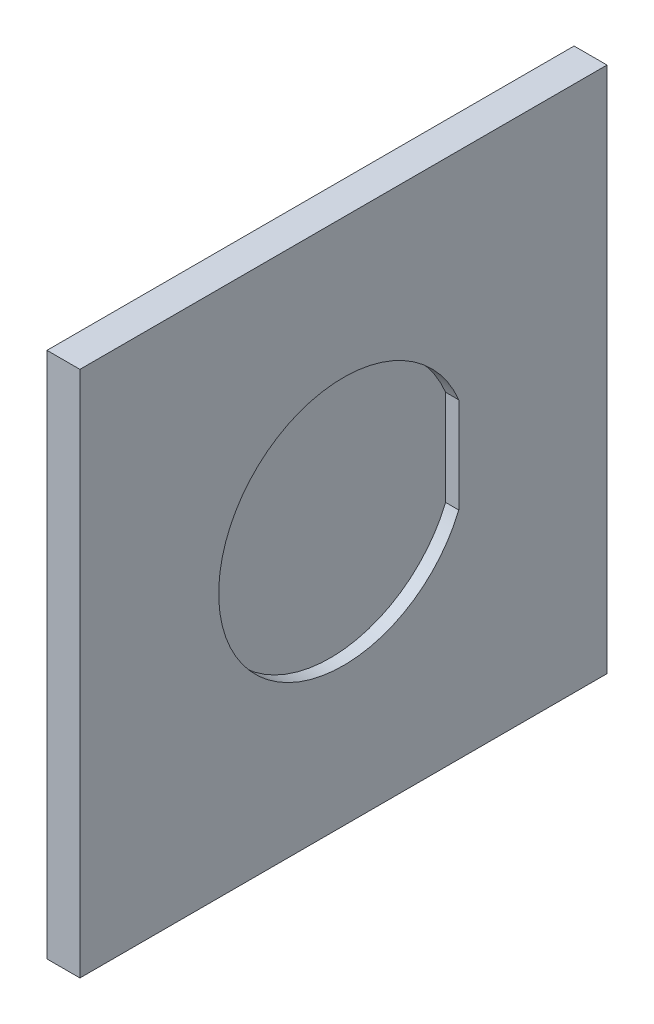
ISO-10303-21;
HEADER;
FILE_DESCRIPTION(('STEP AP214'),'2;1');
FILE_NAME('part.step','',(''),(''),'','','');
FILE_SCHEMA(('AUTOMOTIVE_DESIGN { 1 0 10303 214 1 1 1 1 }'));
ENDSEC;
DATA;
#1=APPLICATION_CONTEXT('core data for automotive mechanical design processes');
#2=APPLICATION_PROTOCOL_DEFINITION('international standard','automotive_design',2000,#1);
#3=PRODUCT_CONTEXT('',#1,'mechanical');
#4=PRODUCT('Part','Part','',(#3));
#5=PRODUCT_RELATED_PRODUCT_CATEGORY('part','',(#4));
#6=PRODUCT_DEFINITION_FORMATION('','',#4);
#7=PRODUCT_DEFINITION_CONTEXT('part definition',#1,'design');
#8=PRODUCT_DEFINITION('design','',#6,#7);
#9=PRODUCT_DEFINITION_SHAPE('','',#8);
#10=(LENGTH_UNIT() NAMED_UNIT(*) SI_UNIT(.MILLI.,.METRE.));
#11=(NAMED_UNIT(*) PLANE_ANGLE_UNIT() SI_UNIT($,.RADIAN.));
#12=(NAMED_UNIT(*) SI_UNIT($,.STERADIAN.) SOLID_ANGLE_UNIT());
#13=UNCERTAINTY_MEASURE_WITH_UNIT(LENGTH_MEASURE(1.E-05),#10,'distance_accuracy_value','');
#14=(GEOMETRIC_REPRESENTATION_CONTEXT(3) GLOBAL_UNCERTAINTY_ASSIGNED_CONTEXT((#13)) GLOBAL_UNIT_ASSIGNED_CONTEXT((#10,
#11,#12)) REPRESENTATION_CONTEXT('',''));
#15=CARTESIAN_POINT('',(0.,0.,0.));
#16=DIRECTION('',(0.,0.,1.));
#17=DIRECTION('',(1.,0.,0.));
#18=AXIS2_PLACEMENT_3D('',#15,#16,#17);
#19=CARTESIAN_POINT('',(5.,0.,0.));
#20=DIRECTION('',(-1.,0.,0.));
#21=DIRECTION('',(0.,0.,1.));
#22=AXIS2_PLACEMENT_3D('',#19,#20,#21);
#23=PLANE('',#22);
#24=DIRECTION('',(0.,-1.,0.));
#25=VECTOR('',#24,1.);
#26=CARTESIAN_POINT('',(5.,0.,-57.5));
#27=LINE('',#26,#25);
#28=CARTESIAN_POINT('',(5.,47.24105,-57.5));
#29=VERTEX_POINT('',#28);
#30=CARTESIAN_POINT('',(5.,32.75895,-57.5));
#31=VERTEX_POINT('',#30);
#32=EDGE_CURVE('E49',#29,#31,#27,.T.);
#33=ORIENTED_EDGE('',*,*,#32,.T.);
#34=CARTESIAN_POINT('',(5.,40.,-40.));
#35=DIRECTION('',(-1.,0.,0.));
#36=DIRECTION('',(0.,0.,1.));
#37=AXIS2_PLACEMENT_3D('',#34,#35,#36);
#38=CIRCLE('',#37,18.9389230185483);
#39=EDGE_CURVE('E11',#31,#29,#38,.T.);
#40=ORIENTED_EDGE('',*,*,#39,.T.);
#41=EDGE_LOOP('',(#33,#40));
#42=FACE_BOUND('',#41,.T.);
#43=DIRECTION('',(0.,-1.,0.));
#44=VECTOR('',#43,1.);
#45=CARTESIAN_POINT('',(5.,0.,0.));
#46=LINE('',#45,#44);
#47=CARTESIAN_POINT('',(5.,80.,0.));
#48=VERTEX_POINT('',#47);
#49=CARTESIAN_POINT('',(5.,0.,0.));
#50=VERTEX_POINT('',#49);
#51=EDGE_CURVE('E120',#48,#50,#46,.T.);
#52=ORIENTED_EDGE('',*,*,#51,.T.);
#53=DIRECTION('',(0.,0.,-1.));
#54=VECTOR('',#53,1.);
#55=CARTESIAN_POINT('',(5.,0.,0.));
#56=LINE('',#55,#54);
#57=CARTESIAN_POINT('',(5.,0.,-80.));
#58=VERTEX_POINT('',#57);
#59=EDGE_CURVE('E94',#50,#58,#56,.T.);
#60=ORIENTED_EDGE('',*,*,#59,.T.);
#61=DIRECTION('',(0.,1.,0.));
#62=VECTOR('',#61,1.);
#63=CARTESIAN_POINT('',(5.,0.,-80.));
#64=LINE('',#63,#62);
#65=CARTESIAN_POINT('',(5.,80.,-80.));
#66=VERTEX_POINT('',#65);
#67=EDGE_CURVE('E123',#58,#66,#64,.T.);
#68=ORIENTED_EDGE('',*,*,#67,.T.);
#69=DIRECTION('',(0.,0.,1.));
#70=VECTOR('',#69,1.);
#71=CARTESIAN_POINT('',(5.,80.,0.));
#72=LINE('',#71,#70);
#73=EDGE_CURVE('E65',#66,#48,#72,.T.);
#74=ORIENTED_EDGE('',*,*,#73,.T.);
#75=EDGE_LOOP('',(#52,#60,#68,#74));
#76=FACE_BOUND('',#75,.T.);
#77=ADVANCED_FACE('F41',(#42,#76),#23,.F.);
#78=CARTESIAN_POINT('',(5.,0.,0.));
#79=DIRECTION('',(0.,0.,-1.));
#80=DIRECTION('',(-1.,0.,0.));
#81=AXIS2_PLACEMENT_3D('',#78,#79,#80);
#82=PLANE('',#81);
#83=DIRECTION('',(0.,-1.,0.));
#84=VECTOR('',#83,1.);
#85=CARTESIAN_POINT('',(0.,0.,0.));
#86=LINE('',#85,#84);
#87=CARTESIAN_POINT('',(0.,80.,0.));
#88=VERTEX_POINT('',#87);
#89=CARTESIAN_POINT('',(0.,0.,0.));
#90=VERTEX_POINT('',#89);
#91=EDGE_CURVE('E118',#88,#90,#86,.T.);
#92=ORIENTED_EDGE('',*,*,#91,.T.);
#93=DIRECTION('',(-1.,0.,0.));
#94=VECTOR('',#93,1.);
#95=CARTESIAN_POINT('',(5.,0.,0.));
#96=LINE('',#95,#94);
#97=EDGE_CURVE('E140',#50,#90,#96,.T.);
#98=ORIENTED_EDGE('',*,*,#97,.F.);
#99=ORIENTED_EDGE('',*,*,#51,.F.);
#100=DIRECTION('',(-1.,0.,0.));
#101=VECTOR('',#100,1.);
#102=CARTESIAN_POINT('',(5.,80.,0.));
#103=LINE('',#102,#101);
#104=EDGE_CURVE('E126',#48,#88,#103,.T.);
#105=ORIENTED_EDGE('',*,*,#104,.T.);
#106=EDGE_LOOP('',(#92,#98,#99,#105));
#107=FACE_BOUND('',#106,.T.);
#108=ADVANCED_FACE('F43',(#107),#82,.F.);
#109=CARTESIAN_POINT('',(5.,0.,0.));
#110=DIRECTION('',(0.,1.,0.));
#111=DIRECTION('',(0.,0.,1.));
#112=AXIS2_PLACEMENT_3D('',#109,#110,#111);
#113=PLANE('',#112);
#114=DIRECTION('',(0.,0.,-1.));
#115=VECTOR('',#114,1.);
#116=CARTESIAN_POINT('',(0.,0.,0.));
#117=LINE('',#116,#115);
#118=CARTESIAN_POINT('',(0.,0.,-80.));
#119=VERTEX_POINT('',#118);
#120=EDGE_CURVE('E129',#90,#119,#117,.T.);
#121=ORIENTED_EDGE('',*,*,#120,.T.);
#122=DIRECTION('',(-1.,0.,0.));
#123=VECTOR('',#122,1.);
#124=CARTESIAN_POINT('',(5.,0.,-80.));
#125=LINE('',#124,#123);
#126=EDGE_CURVE('E137',#58,#119,#125,.T.);
#127=ORIENTED_EDGE('',*,*,#126,.F.);
#128=ORIENTED_EDGE('',*,*,#59,.F.);
#129=ORIENTED_EDGE('',*,*,#97,.T.);
#130=EDGE_LOOP('',(#121,#127,#128,#129));
#131=FACE_BOUND('',#130,.T.);
#132=ADVANCED_FACE('F148',(#131),#113,.F.);
#133=CARTESIAN_POINT('',(5.,0.,-80.));
#134=DIRECTION('',(0.,0.,1.));
#135=DIRECTION('',(1.,0.,0.));
#136=AXIS2_PLACEMENT_3D('',#133,#134,#135);
#137=PLANE('',#136);
#138=DIRECTION('',(0.,1.,0.));
#139=VECTOR('',#138,1.);
#140=CARTESIAN_POINT('',(0.,0.,-80.));
#141=LINE('',#140,#139);
#142=CARTESIAN_POINT('',(0.,80.,-80.));
#143=VERTEX_POINT('',#142);
#144=EDGE_CURVE('E131',#119,#143,#141,.T.);
#145=ORIENTED_EDGE('',*,*,#144,.T.);
#146=DIRECTION('',(-1.,0.,0.));
#147=VECTOR('',#146,1.);
#148=CARTESIAN_POINT('',(5.,80.,-80.));
#149=LINE('',#148,#147);
#150=EDGE_CURVE('E135',#66,#143,#149,.T.);
#151=ORIENTED_EDGE('',*,*,#150,.F.);
#152=ORIENTED_EDGE('',*,*,#67,.F.);
#153=ORIENTED_EDGE('',*,*,#126,.T.);
#154=EDGE_LOOP('',(#145,#151,#152,#153));
#155=FACE_BOUND('',#154,.T.);
#156=ADVANCED_FACE('F153',(#155),#137,.F.);
#157=CARTESIAN_POINT('',(5.,80.,0.));
#158=DIRECTION('',(0.,-1.,0.));
#159=DIRECTION('',(0.,0.,-1.));
#160=AXIS2_PLACEMENT_3D('',#157,#158,#159);
#161=PLANE('',#160);
#162=DIRECTION('',(0.,0.,1.));
#163=VECTOR('',#162,1.);
#164=CARTESIAN_POINT('',(0.,80.,0.));
#165=LINE('',#164,#163);
#166=EDGE_CURVE('E86',#143,#88,#165,.T.);
#167=ORIENTED_EDGE('',*,*,#166,.T.);
#168=ORIENTED_EDGE('',*,*,#104,.F.);
#169=ORIENTED_EDGE('',*,*,#73,.F.);
#170=ORIENTED_EDGE('',*,*,#150,.T.);
#171=EDGE_LOOP('',(#167,#168,#169,#170));
#172=FACE_BOUND('',#171,.T.);
#173=ADVANCED_FACE('F157',(#172),#161,.F.);
#174=CARTESIAN_POINT('',(0.,0.,0.));
#175=DIRECTION('',(-1.,0.,0.));
#176=DIRECTION('',(0.,0.,1.));
#177=AXIS2_PLACEMENT_3D('',#174,#175,#176);
#178=PLANE('',#177);
#179=ORIENTED_EDGE('',*,*,#91,.F.);
#180=ORIENTED_EDGE('',*,*,#166,.F.);
#181=ORIENTED_EDGE('',*,*,#144,.F.);
#182=ORIENTED_EDGE('',*,*,#120,.F.);
#183=EDGE_LOOP('',(#179,#180,#181,#182));
#184=FACE_BOUND('',#183,.T.);
#185=ADVANCED_FACE('F155',(#184),#178,.T.);
#186=CARTESIAN_POINT('',(3.,40.,-40.));
#187=DIRECTION('',(1.,0.,0.));
#188=DIRECTION('',(0.,0.,-1.));
#189=AXIS2_PLACEMENT_3D('',#186,#187,#188);
#190=CYLINDRICAL_SURFACE('',#189,18.9389230185483);
#191=DIRECTION('',(1.,0.,0.));
#192=VECTOR('',#191,1.);
#193=CARTESIAN_POINT('',(3.,32.75895,-57.5));
#194=LINE('',#193,#192);
#195=CARTESIAN_POINT('',(3.,32.75895,-57.5));
#196=VERTEX_POINT('',#195);
#197=EDGE_CURVE('E56',#196,#31,#194,.T.);
#198=ORIENTED_EDGE('',*,*,#197,.F.);
#199=CARTESIAN_POINT('',(3.,40.,-40.));
#200=DIRECTION('',(1.,0.,0.));
#201=DIRECTION('',(0.,0.,-1.));
#202=AXIS2_PLACEMENT_3D('',#199,#200,#201);
#203=CIRCLE('',#202,18.9389230185483);
#204=CARTESIAN_POINT('',(3.,47.24105,-57.5));
#205=VERTEX_POINT('',#204);
#206=EDGE_CURVE('E106',#205,#196,#203,.T.);
#207=ORIENTED_EDGE('',*,*,#206,.F.);
#208=DIRECTION('',(1.,0.,0.));
#209=VECTOR('',#208,1.);
#210=CARTESIAN_POINT('',(3.,47.24105,-57.5));
#211=LINE('',#210,#209);
#212=EDGE_CURVE('E109',#205,#29,#211,.T.);
#213=ORIENTED_EDGE('',*,*,#212,.T.);
#214=ORIENTED_EDGE('',*,*,#39,.F.);
#215=EDGE_LOOP('',(#198,#207,#213,#214));
#216=FACE_BOUND('',#215,.T.);
#217=ADVANCED_FACE('F104',(#216),#190,.F.);
#218=CARTESIAN_POINT('',(3.,32.75895,-57.5));
#219=DIRECTION('',(0.,0.,-1.));
#220=DIRECTION('',(0.,1.,0.));
#221=AXIS2_PLACEMENT_3D('',#218,#219,#220);
#222=PLANE('',#221);
#223=ORIENTED_EDGE('',*,*,#212,.F.);
#224=DIRECTION('',(0.,1.,0.));
#225=VECTOR('',#224,1.);
#226=CARTESIAN_POINT('',(3.,32.75895,-57.5));
#227=LINE('',#226,#225);
#228=EDGE_CURVE('E110',#196,#205,#227,.T.);
#229=ORIENTED_EDGE('',*,*,#228,.F.);
#230=ORIENTED_EDGE('',*,*,#197,.T.);
#231=ORIENTED_EDGE('',*,*,#32,.F.);
#232=EDGE_LOOP('',(#223,#229,#230,#231));
#233=FACE_BOUND('',#232,.T.);
#234=ADVANCED_FACE('F115',(#233),#222,.F.);
#235=CARTESIAN_POINT('',(3.,40.,-40.));
#236=DIRECTION('',(1.,0.,0.));
#237=DIRECTION('',(0.,0.,-1.));
#238=AXIS2_PLACEMENT_3D('',#235,#236,#237);
#239=PLANE('',#238);
#240=ORIENTED_EDGE('',*,*,#206,.T.);
#241=ORIENTED_EDGE('',*,*,#228,.T.);
#242=EDGE_LOOP('',(#240,#241));
#243=FACE_BOUND('',#242,.T.);
#244=ADVANCED_FACE('F113',(#243),#239,.T.);
#245=CLOSED_SHELL('',(#77,#108,#132,#156,#173,#185,#217,#234,#244));
#246=MANIFOLD_SOLID_BREP('B2',#245);
#247=ADVANCED_BREP_SHAPE_REPRESENTATION('',(#18,#246),#14);
#248=SHAPE_DEFINITION_REPRESENTATION(#9,#247);
ENDSEC;
END-ISO-10303-21;
